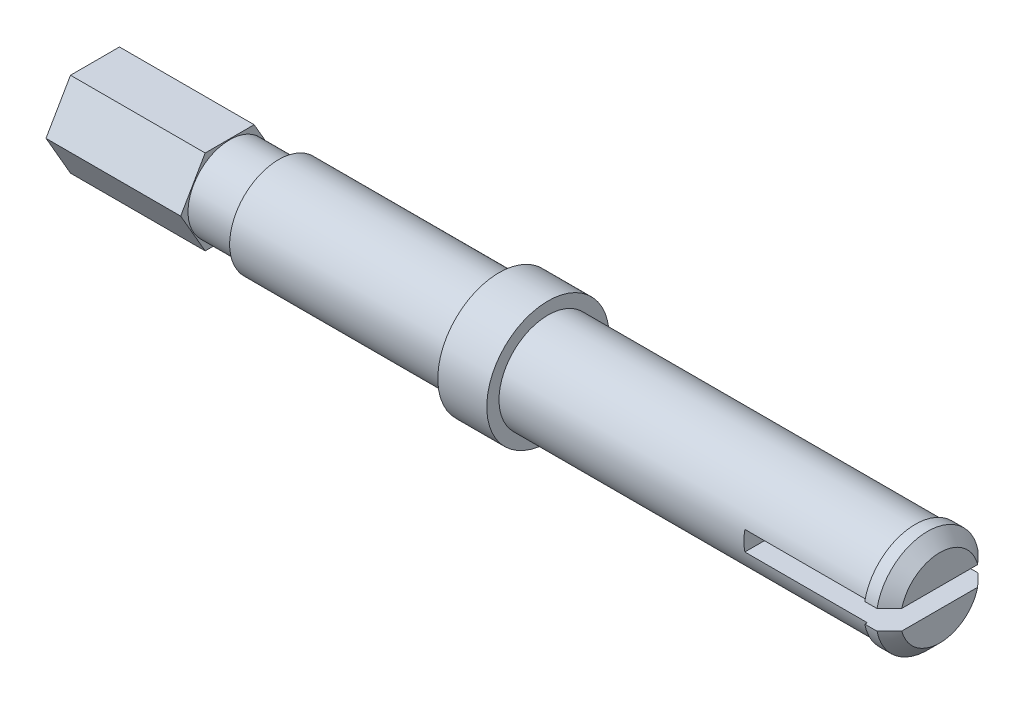
ISO-10303-21;
HEADER;
FILE_DESCRIPTION(('STEP AP214'),'2;1');
FILE_NAME('part.step','',(''),(''),'','','');
FILE_SCHEMA(('AUTOMOTIVE_DESIGN { 1 0 10303 214 1 1 1 1 }'));
ENDSEC;
DATA;
#1=APPLICATION_CONTEXT('core data for automotive mechanical design processes');
#2=APPLICATION_PROTOCOL_DEFINITION('international standard','automotive_design',2000,#1);
#3=PRODUCT_CONTEXT('',#1,'mechanical');
#4=PRODUCT('Part','Part','',(#3));
#5=PRODUCT_RELATED_PRODUCT_CATEGORY('part','',(#4));
#6=PRODUCT_DEFINITION_FORMATION('','',#4);
#7=PRODUCT_DEFINITION_CONTEXT('part definition',#1,'design');
#8=PRODUCT_DEFINITION('design','',#6,#7);
#9=PRODUCT_DEFINITION_SHAPE('','',#8);
#10=(LENGTH_UNIT() NAMED_UNIT(*) SI_UNIT(.MILLI.,.METRE.));
#11=(NAMED_UNIT(*) PLANE_ANGLE_UNIT() SI_UNIT($,.RADIAN.));
#12=(NAMED_UNIT(*) SI_UNIT($,.STERADIAN.) SOLID_ANGLE_UNIT());
#13=UNCERTAINTY_MEASURE_WITH_UNIT(LENGTH_MEASURE(1.E-05),#10,'distance_accuracy_value','');
#14=(GEOMETRIC_REPRESENTATION_CONTEXT(3) GLOBAL_UNCERTAINTY_ASSIGNED_CONTEXT((#13)) GLOBAL_UNIT_ASSIGNED_CONTEXT((#10,
#11,#12)) REPRESENTATION_CONTEXT('',''));
#15=CARTESIAN_POINT('',(0.,0.,0.));
#16=DIRECTION('',(0.,0.,1.));
#17=DIRECTION('',(1.,0.,0.));
#18=AXIS2_PLACEMENT_3D('',#15,#16,#17);
#19=CARTESIAN_POINT('',(33.5,0.,0.));
#20=DIRECTION('',(1.,0.,0.));
#21=DIRECTION('',(0.,0.,-1.));
#22=AXIS2_PLACEMENT_3D('',#19,#20,#21);
#23=PLANE('',#22);
#24=CARTESIAN_POINT('',(33.5,0.,0.));
#25=DIRECTION('',(1.,0.,0.));
#26=DIRECTION('',(0.,0.,-1.));
#27=AXIS2_PLACEMENT_3D('',#24,#25,#26);
#28=CIRCLE('',#27,2.1);
#29=CARTESIAN_POINT('',(33.5,0.4,-2.06155281280883));
#30=VERTEX_POINT('',#29);
#31=CARTESIAN_POINT('',(33.5,0.4,2.06155281280883));
#32=VERTEX_POINT('',#31);
#33=EDGE_CURVE('E265',#30,#32,#28,.T.);
#34=ORIENTED_EDGE('',*,*,#33,.F.);
#35=DIRECTION('',(0.,0.,1.));
#36=VECTOR('',#35,1.);
#37=CARTESIAN_POINT('',(33.5,0.4,0.));
#38=LINE('',#37,#36);
#39=CARTESIAN_POINT('',(33.5,0.4,-1.95959179422654));
#40=VERTEX_POINT('',#39);
#41=EDGE_CURVE('E267',#30,#40,#38,.T.);
#42=ORIENTED_EDGE('',*,*,#41,.T.);
#43=CARTESIAN_POINT('',(33.5,0.,0.));
#44=DIRECTION('',(1.,0.,0.));
#45=DIRECTION('',(0.,0.,-1.));
#46=AXIS2_PLACEMENT_3D('',#43,#44,#45);
#47=CIRCLE('',#46,2.);
#48=CARTESIAN_POINT('',(33.5,0.4,1.95959179422654));
#49=VERTEX_POINT('',#48);
#50=EDGE_CURVE('E155',#40,#49,#47,.T.);
#51=ORIENTED_EDGE('',*,*,#50,.T.);
#52=EDGE_CURVE('E271',#49,#32,#38,.T.);
#53=ORIENTED_EDGE('',*,*,#52,.T.);
#54=EDGE_LOOP('',(#34,#42,#51,#53));
#55=FACE_BOUND('',#54,.T.);
#56=ADVANCED_FACE('F34',(#55),#23,.F.);
#57=CARTESIAN_POINT('',(33.5,0.,0.));
#58=DIRECTION('',(1.,0.,0.));
#59=DIRECTION('',(0.,0.,-1.));
#60=AXIS2_PLACEMENT_3D('',#57,#58,#59);
#61=CYLINDRICAL_SURFACE('',#60,2.1);
#62=DIRECTION('',(1.,0.,0.));
#63=VECTOR('',#62,1.);
#64=CARTESIAN_POINT('',(33.5,0.4,2.06155281280883));
#65=LINE('',#64,#63);
#66=CARTESIAN_POINT('',(34.,0.4,2.06155281280883));
#67=VERTEX_POINT('',#66);
#68=EDGE_CURVE('E329',#67,#32,#65,.F.);
#69=ORIENTED_EDGE('',*,*,#68,.F.);
#70=CARTESIAN_POINT('',(34.,0.,0.));
#71=DIRECTION('',(1.,0.,0.));
#72=DIRECTION('',(0.,0.,-1.));
#73=AXIS2_PLACEMENT_3D('',#70,#71,#72);
#74=CIRCLE('',#73,2.1);
#75=CARTESIAN_POINT('',(34.,0.4,-2.06155281280883));
#76=VERTEX_POINT('',#75);
#77=EDGE_CURVE('E162',#67,#76,#74,.F.);
#78=ORIENTED_EDGE('',*,*,#77,.T.);
#79=DIRECTION('',(1.,0.,0.));
#80=VECTOR('',#79,1.);
#81=CARTESIAN_POINT('',(33.5,0.4,-2.06155281280883));
#82=LINE('',#81,#80);
#83=EDGE_CURVE('E322',#30,#76,#82,.T.);
#84=ORIENTED_EDGE('',*,*,#83,.F.);
#85=ORIENTED_EDGE('',*,*,#33,.T.);
#86=EDGE_LOOP('',(#69,#78,#84,#85));
#87=FACE_BOUND('',#86,.T.);
#88=ADVANCED_FACE('F197',(#87),#61,.T.);
#89=CARTESIAN_POINT('',(34.5,0.,0.));
#90=DIRECTION('',(1.,0.,0.));
#91=DIRECTION('',(0.,0.,-1.));
#92=AXIS2_PLACEMENT_3D('',#89,#90,#91);
#93=PLANE('',#92);
#94=DIRECTION('',(0.,0.,1.));
#95=VECTOR('',#94,1.);
#96=CARTESIAN_POINT('',(34.5,0.4,-2.5));
#97=LINE('',#96,#95);
#98=CARTESIAN_POINT('',(34.5,0.4,-1.54919333848296));
#99=VERTEX_POINT('',#98);
#100=CARTESIAN_POINT('',(34.5,0.4,1.54919333848296));
#101=VERTEX_POINT('',#100);
#102=EDGE_CURVE('E351',#99,#101,#97,.T.);
#103=ORIENTED_EDGE('',*,*,#102,.F.);
#104=CARTESIAN_POINT('',(34.5,0.,0.));
#105=DIRECTION('',(1.,0.,0.));
#106=DIRECTION('',(0.,0.,-1.));
#107=AXIS2_PLACEMENT_3D('',#104,#105,#106);
#108=CIRCLE('',#107,1.6);
#109=EDGE_CURVE('E159',#99,#101,#108,.T.);
#110=ORIENTED_EDGE('',*,*,#109,.T.);
#111=EDGE_LOOP('',(#103,#110));
#112=FACE_BOUND('',#111,.T.);
#113=ADVANCED_FACE('F201',(#112),#93,.T.);
#114=CARTESIAN_POINT('',(34.5,0.,0.));
#115=DIRECTION('',(-1.,0.,0.));
#116=DIRECTION('',(0.,0.,1.));
#117=AXIS2_PLACEMENT_3D('',#114,#115,#116);
#118=CONICAL_SURFACE('',#117,1.6,0.785398163397451);
#119=CARTESIAN_POINT('',(31.4620056820932,0.400000000000001,-4.62071328832853));
#120=CARTESIAN_POINT('',(31.6267282288878,0.400000000000001,-4.45536888012812));
#121=CARTESIAN_POINT('',(31.7914232324066,0.400000000000001,-4.28999698174511));
#122=CARTESIAN_POINT('',(32.120729349125,0.400000000000001,-3.9591493277016));
#123=CARTESIAN_POINT('',(32.2853404565067,0.400000000000001,-3.79367356625066));
#124=CARTESIAN_POINT('',(32.6146735626456,0.400000000000001,-3.46234430265822));
#125=CARTESIAN_POINT('',(32.7793953639427,0.400000000000001,-3.29649060422175));
#126=CARTESIAN_POINT('',(33.1086229545556,0.4,-2.96458859573897));
#127=CARTESIAN_POINT('',(33.2731287562648,0.4,-2.79854029799451));
#128=CARTESIAN_POINT('',(33.5916971165518,0.4,-2.47631379402679));
#129=CARTESIAN_POINT('',(33.7457803104458,0.4,-2.32015599034724));
#130=CARTESIAN_POINT('',(34.053445304274,0.4,-2.00729305242233));
#131=CARTESIAN_POINT('',(34.2070270133369,0.4,-1.85058782859063));
#132=CARTESIAN_POINT('',(34.4365007226751,0.4,-1.61478989074282));
#133=CARTESIAN_POINT('',(34.5128084628646,0.4,-1.53610233507543));
#134=CARTESIAN_POINT('',(34.6649874756702,0.4,-1.37829595442104));
#135=CARTESIAN_POINT('',(34.7408587186471,0.4,-1.29917710084209));
#136=CARTESIAN_POINT('',(34.8918589543585,0.4,-1.14027745631293));
#137=CARTESIAN_POINT('',(34.9669881734101,0.4,-1.06049688176115));
#138=CARTESIAN_POINT('',(35.0786527718135,0.4,-0.939879988891926));
#139=CARTESIAN_POINT('',(35.1157007731961,0.4,-0.899518913761242));
#140=CARTESIAN_POINT('',(35.1892939808212,0.4,-0.818341640017616));
#141=CARTESIAN_POINT('',(35.2258392068452,0.4,-0.777525459425747));
#142=CARTESIAN_POINT('',(35.2822181422698,0.4,-0.713362663205651));
#143=CARTESIAN_POINT('',(35.3023157518278,0.4,-0.690248181956688));
#144=CARTESIAN_POINT('',(35.3421973890748,0.4,-0.643745585800347));
#145=CARTESIAN_POINT('',(35.3619813853881,0.4,-0.620357443916147));
#146=CARTESIAN_POINT('',(35.4013388970203,0.4,-0.572977645618859));
#147=CARTESIAN_POINT('',(35.4209078738351,0.4,-0.548982205879127));
#148=CARTESIAN_POINT('',(35.4594477676603,0.4,-0.500523026710144));
#149=CARTESIAN_POINT('',(35.4784188324995,0.4,-0.476059405477448));
#150=CARTESIAN_POINT('',(35.5157357715621,0.4,-0.426195091492249));
#151=CARTESIAN_POINT('',(35.5340714113886,0.4,-0.400786676553507));
#152=CARTESIAN_POINT('',(35.5694662153485,0.4,-0.349033128819541));
#153=CARTESIAN_POINT('',(35.5865236475902,0.4,-0.32268679399008));
#154=CARTESIAN_POINT('',(35.6184178541365,0.4,-0.269040710017076));
#155=CARTESIAN_POINT('',(35.6332766197385,0.4,-0.241754328952145));
#156=CARTESIAN_POINT('',(35.6597018760107,0.4,-0.185665867034453));
#157=CARTESIAN_POINT('',(35.6712787010701,0.4,-0.156868890074849));
#158=CARTESIAN_POINT('',(35.6884585286207,0.4,-0.100130615637488));
#159=CARTESIAN_POINT('',(35.6944880875649,0.4,-0.0723271031333663));
#160=CARTESIAN_POINT('',(35.700633227419,0.4,-0.0161590419789652));
#161=CARTESIAN_POINT('',(35.7007780646195,0.4,0.012202029725148));
#162=CARTESIAN_POINT('',(35.6951959633118,0.4,0.0681578137637577));
#163=CARTESIAN_POINT('',(35.6894974798404,0.4,0.0957555741716353));
#164=CARTESIAN_POINT('',(35.6776475923944,0.4,0.136204803292051));
#165=CARTESIAN_POINT('',(35.6731234162029,0.4,0.149579574295066));
#166=CARTESIAN_POINT('',(35.6631675217043,0.4,0.175986616646824));
#167=CARTESIAN_POINT('',(35.6577359478612,0.4,0.189018942133694));
#168=CARTESIAN_POINT('',(35.6415866321195,0.4,0.224869237737755));
#169=CARTESIAN_POINT('',(35.6300704184402,0.4,0.247324603841456));
#170=CARTESIAN_POINT('',(35.6054671047588,0.4,0.291366277105348));
#171=CARTESIAN_POINT('',(35.5923782513888,0.4,0.312951577739852));
#172=CARTESIAN_POINT('',(35.551444304707,0.4,0.376827151276196));
#173=CARTESIAN_POINT('',(35.5220080591233,0.4,0.418087328138647));
#174=CARTESIAN_POINT('',(35.4607450791305,0.4,0.499349139649737));
#175=CARTESIAN_POINT('',(35.4288982477432,0.4,0.53933504534657));
#176=CARTESIAN_POINT('',(35.3640296610522,0.4,0.61818466431528));
#177=CARTESIAN_POINT('',(35.3310107994486,0.4,0.657050763349219));
#178=CARTESIAN_POINT('',(35.2649264334703,0.4,0.733279283772284));
#179=CARTESIAN_POINT('',(35.2318773305982,0.4,0.770656052569773));
#180=CARTESIAN_POINT('',(35.1652824925224,0.4,0.844965407885262));
#181=CARTESIAN_POINT('',(35.1317367446572,0.4,0.88189798303517));
#182=CARTESIAN_POINT('',(35.0305795361561,0.4,0.992236910774282));
#183=CARTESIAN_POINT('',(34.962457375675,0.4,1.06517397595159));
#184=CARTESIAN_POINT('',(34.8254013964689,0.4,1.2104413851798));
#185=CARTESIAN_POINT('',(34.7564667082264,0.4,1.2827709038118));
#186=CARTESIAN_POINT('',(34.6181488837314,0.4,1.4269886895793));
#187=CARTESIAN_POINT('',(34.5487657830838,0.4,1.49887699088568));
#188=CARTESIAN_POINT('',(34.3414602074161,0.4,1.7128086778753));
#189=CARTESIAN_POINT('',(34.2031174680887,0.4,1.85444422236948));
#190=CARTESIAN_POINT('',(33.9259449450494,0.4,2.13711347646962));
#191=CARTESIAN_POINT('',(33.7871154040441,0.4,2.27814742473358));
#192=CARTESIAN_POINT('',(33.4674666256911,0.399999999999999,2.60214061024328));
#193=CARTESIAN_POINT('',(33.2865379241783,0.399999999999999,2.78499183509939));
#194=CARTESIAN_POINT('',(32.924361923992,0.399999999999999,3.15043743558007));
#195=CARTESIAN_POINT('',(32.7431145780677,0.399999999999999,3.3330317643258));
#196=CARTESIAN_POINT('',(32.3786093960869,0.399999999999999,3.69989022029294));
#197=CARTESIAN_POINT('',(32.1953497629511,0.399999999999999,3.88415256178822));
#198=CARTESIAN_POINT('',(31.8287392316848,0.399999999999999,4.25252494064875));
#199=CARTESIAN_POINT('',(31.6453883540141,0.399999999999999,4.43663499837383));
#200=CARTESIAN_POINT('',(31.4620056820932,0.399999999999999,4.62071328832853));
#201=B_SPLINE_CURVE_WITH_KNOTS('',3,(#119,#120,#121,#122,#123,#124,#125,#126,#127,#128,#129,
#130,#131,#132,#133,#134,#135,#136,#137,#138,#139,#140,#141,#142,#143,#144,#145,#146,#147,#148,
#149,#150,#151,#152,#153,#154,#155,#156,#157,#158,#159,#160,#161,#162,#163,#164,#165,#166,#167,
#168,#169,#170,#171,#172,#173,#174,#175,#176,#177,#178,#179,#180,#181,#182,#183,#184,#185,#186,
#187,#188,#189,#190,#191,#192,#193,#194,#195,#196,#197,#198,#199,#200),.UNSPECIFIED.,.F.,.F.,(4,
2,2,2,2,2,2,2,2,2,2,2,2,2,2,2,2,2,2,2,2,2,2,2,2,2,2,2,2,2,2,2,2,2,2,2,2,2,2,2,4),(0.,
0.700179042912816,1.40040138764164,2.10166194800309,2.80288034094117,3.4610152346944,
4.11926341464865,4.44809558105204,4.77694981839161,5.10570044927818,5.27005783292464,
5.43440873136774,5.52629648875828,5.61819338184684,5.71107665478386,5.80393678002205,
5.89791125050213,5.99201083077404,6.08509424883953,6.17788121879951,6.2627250475303,
6.34714701756725,6.43115982390147,6.47349318277285,6.51581980828583,6.59142624128437,
6.66711776558301,6.81900222224851,6.9723332284401,7.12530891659257,7.27498149956892,
7.42465790494663,7.72405269399398,8.0238038144764,8.32353141959432,8.91749242445227,
9.51119050285921,10.2828942616009,11.0547241840561,11.834358848275,12.6138627635438),.UNSPECIFIED.);
#202=EDGE_CURVE('E407',#76,#99,#201,.T.);
#203=ORIENTED_EDGE('',*,*,#202,.F.);
#204=ORIENTED_EDGE('',*,*,#77,.F.);
#205=EDGE_CURVE('E172',#101,#67,#201,.T.);
#206=ORIENTED_EDGE('',*,*,#205,.F.);
#207=ORIENTED_EDGE('',*,*,#109,.F.);
#208=EDGE_LOOP('',(#203,#204,#206,#207));
#209=FACE_BOUND('',#208,.T.);
#210=ADVANCED_FACE('F206',(#209),#118,.T.);
#211=CARTESIAN_POINT('',(34.5,0.,0.));
#212=DIRECTION('',(-1.,0.,0.));
#213=DIRECTION('',(0.,0.,1.));
#214=AXIS2_PLACEMENT_3D('',#211,#212,#213);
#215=CYLINDRICAL_SURFACE('',#214,2.);
#216=CARTESIAN_POINT('',(28.5,0.,0.));
#217=DIRECTION('',(1.,0.,0.));
#218=DIRECTION('',(0.,0.,-1.));
#219=AXIS2_PLACEMENT_3D('',#216,#217,#218);
#220=CIRCLE('',#219,2.);
#221=CARTESIAN_POINT('',(28.5,0.4,1.95959179422654));
#222=VERTEX_POINT('',#221);
#223=CARTESIAN_POINT('',(28.5,-0.400000000000001,1.95959179422654));
#224=VERTEX_POINT('',#223);
#225=EDGE_CURVE('E11',#222,#224,#220,.T.);
#226=ORIENTED_EDGE('',*,*,#225,.F.);
#227=DIRECTION('',(-1.,0.,0.));
#228=VECTOR('',#227,1.);
#229=CARTESIAN_POINT('',(34.5,0.4,1.95959179422654));
#230=LINE('',#229,#228);
#231=EDGE_CURVE('E325',#222,#49,#230,.F.);
#232=ORIENTED_EDGE('',*,*,#231,.T.);
#233=ORIENTED_EDGE('',*,*,#50,.F.);
#234=DIRECTION('',(-1.,0.,0.));
#235=VECTOR('',#234,1.);
#236=CARTESIAN_POINT('',(34.5,0.4,-1.95959179422654));
#237=LINE('',#236,#235);
#238=CARTESIAN_POINT('',(28.5,0.4,-1.95959179422654));
#239=VERTEX_POINT('',#238);
#240=EDGE_CURVE('E282',#40,#239,#237,.T.);
#241=ORIENTED_EDGE('',*,*,#240,.T.);
#242=CARTESIAN_POINT('',(28.5,-0.4,-1.95959179422654));
#243=VERTEX_POINT('',#242);
#244=EDGE_CURVE('E39',#243,#239,#220,.T.);
#245=ORIENTED_EDGE('',*,*,#244,.F.);
#246=DIRECTION('',(-1.,0.,0.));
#247=VECTOR('',#246,1.);
#248=CARTESIAN_POINT('',(34.5,-0.4,-1.95959179422654));
#249=LINE('',#248,#247);
#250=CARTESIAN_POINT('',(33.5,-0.4,-1.95959179422654));
#251=VERTEX_POINT('',#250);
#252=EDGE_CURVE('E339',#243,#251,#249,.F.);
#253=ORIENTED_EDGE('',*,*,#252,.T.);
#254=CARTESIAN_POINT('',(33.5,-0.400000000000001,1.95959179422654));
#255=VERTEX_POINT('',#254);
#256=EDGE_CURVE('E154',#255,#251,#47,.T.);
#257=ORIENTED_EDGE('',*,*,#256,.F.);
#258=DIRECTION('',(-1.,0.,0.));
#259=VECTOR('',#258,1.);
#260=CARTESIAN_POINT('',(34.5,-0.400000000000001,1.95959179422654));
#261=LINE('',#260,#259);
#262=EDGE_CURVE('E332',#255,#224,#261,.T.);
#263=ORIENTED_EDGE('',*,*,#262,.T.);
#264=EDGE_LOOP('',(#226,#232,#233,#241,#245,#253,#257,#263));
#265=FACE_BOUND('',#264,.T.);
#266=CARTESIAN_POINT('',(18.5,0.,0.));
#267=DIRECTION('',(1.,0.,0.));
#268=DIRECTION('',(0.,0.,-1.));
#269=AXIS2_PLACEMENT_3D('',#266,#267,#268);
#270=CIRCLE('',#269,2.);
#271=CARTESIAN_POINT('',(18.5,0.,-2.));
#272=VERTEX_POINT('',#271);
#273=EDGE_CURVE('E275',#272,#272,#270,.T.);
#274=ORIENTED_EDGE('',*,*,#273,.T.);
#275=EDGE_LOOP('',(#274));
#276=FACE_BOUND('',#275,.T.);
#277=ADVANCED_FACE('F202',(#265,#276),#215,.T.);
#278=CARTESIAN_POINT('',(18.5,0.,0.));
#279=DIRECTION('',(1.,0.,0.));
#280=DIRECTION('',(0.,0.,-1.));
#281=AXIS2_PLACEMENT_3D('',#278,#279,#280);
#282=PLANE('',#281);
#283=CARTESIAN_POINT('',(18.5,0.,0.));
#284=DIRECTION('',(1.,0.,0.));
#285=DIRECTION('',(0.,0.,-1.));
#286=AXIS2_PLACEMENT_3D('',#283,#284,#285);
#287=CIRCLE('',#286,2.5);
#288=CARTESIAN_POINT('',(18.5,0.,-2.5));
#289=VERTEX_POINT('',#288);
#290=EDGE_CURVE('E286',#289,#289,#287,.T.);
#291=ORIENTED_EDGE('',*,*,#290,.T.);
#292=EDGE_LOOP('',(#291));
#293=FACE_BOUND('',#292,.T.);
#294=ORIENTED_EDGE('',*,*,#273,.F.);
#295=EDGE_LOOP('',(#294));
#296=FACE_BOUND('',#295,.T.);
#297=ADVANCED_FACE('F205',(#293,#296),#282,.T.);
#298=CARTESIAN_POINT('',(5.5,0.,0.));
#299=DIRECTION('',(1.,0.,0.));
#300=DIRECTION('',(0.,0.,-1.));
#301=AXIS2_PLACEMENT_3D('',#298,#299,#300);
#302=PLANE('',#301);
#303=DIRECTION('',(0.,-0.866025403784438,0.500000000000001));
#304=VECTOR('',#303,1.);
#305=CARTESIAN_POINT('',(5.5,1.73205080756887,1.));
#306=LINE('',#305,#304);
#307=CARTESIAN_POINT('',(5.5,1.73205080756887,1.));
#308=VERTEX_POINT('',#307);
#309=CARTESIAN_POINT('',(5.5,0.,2.));
#310=VERTEX_POINT('',#309);
#311=EDGE_CURVE('E145',#308,#310,#306,.T.);
#312=ORIENTED_EDGE('',*,*,#311,.T.);
#313=DIRECTION('',(0.,-0.866025403784439,-0.499999999999999));
#314=VECTOR('',#313,1.);
#315=CARTESIAN_POINT('',(5.5,0.,2.));
#316=LINE('',#315,#314);
#317=CARTESIAN_POINT('',(5.5,-1.73205080756888,1.));
#318=VERTEX_POINT('',#317);
#319=EDGE_CURVE('E95',#310,#318,#316,.T.);
#320=ORIENTED_EDGE('',*,*,#319,.T.);
#321=DIRECTION('',(0.,0.,-1.));
#322=VECTOR('',#321,1.);
#323=CARTESIAN_POINT('',(5.5,-1.73205080756888,1.));
#324=LINE('',#323,#322);
#325=CARTESIAN_POINT('',(5.5,-1.73205080756888,-1.));
#326=VERTEX_POINT('',#325);
#327=EDGE_CURVE('E112',#318,#326,#324,.T.);
#328=ORIENTED_EDGE('',*,*,#327,.T.);
#329=DIRECTION('',(0.,0.866025403784439,-0.499999999999999));
#330=VECTOR('',#329,1.);
#331=CARTESIAN_POINT('',(5.5,-1.73205080756888,-1.));
#332=LINE('',#331,#330);
#333=CARTESIAN_POINT('',(5.5,0.,-2.));
#334=VERTEX_POINT('',#333);
#335=EDGE_CURVE('E104',#326,#334,#332,.T.);
#336=ORIENTED_EDGE('',*,*,#335,.T.);
#337=DIRECTION('',(0.,0.866025403784439,0.499999999999999));
#338=VECTOR('',#337,1.);
#339=CARTESIAN_POINT('',(5.5,0.,-2.));
#340=LINE('',#339,#338);
#341=CARTESIAN_POINT('',(5.5,1.73205080756888,-1.));
#342=VERTEX_POINT('',#341);
#343=EDGE_CURVE('E109',#334,#342,#340,.T.);
#344=ORIENTED_EDGE('',*,*,#343,.T.);
#345=DIRECTION('',(0.,0.,1.));
#346=VECTOR('',#345,1.);
#347=CARTESIAN_POINT('',(5.5,1.73205080756888,-1.));
#348=LINE('',#347,#346);
#349=EDGE_CURVE('E59',#342,#308,#348,.T.);
#350=ORIENTED_EDGE('',*,*,#349,.T.);
#351=EDGE_LOOP('',(#312,#320,#328,#336,#344,#350));
#352=FACE_BOUND('',#351,.T.);
#353=CARTESIAN_POINT('',(5.5,0.,0.));
#354=DIRECTION('',(1.,0.,0.));
#355=DIRECTION('',(0.,0.,-1.));
#356=AXIS2_PLACEMENT_3D('',#353,#354,#355);
#357=CIRCLE('',#356,1.7);
#358=CARTESIAN_POINT('',(5.5,0.,-1.7));
#359=VERTEX_POINT('',#358);
#360=EDGE_CURVE('E295',#359,#359,#357,.T.);
#361=ORIENTED_EDGE('',*,*,#360,.F.);
#362=EDGE_LOOP('',(#361));
#363=FACE_BOUND('',#362,.T.);
#364=ADVANCED_FACE('F106',(#352,#363),#302,.T.);
#365=CARTESIAN_POINT('',(5.5,1.73205080756887,1.));
#366=DIRECTION('',(0.,-0.500000000000001,-0.866025403784438));
#367=DIRECTION('',(0.,0.866025403784438,-0.500000000000001));
#368=AXIS2_PLACEMENT_3D('',#365,#366,#367);
#369=PLANE('',#368);
#370=DIRECTION('',(0.,-0.866025403784438,0.500000000000001));
#371=VECTOR('',#370,1.);
#372=CARTESIAN_POINT('',(0.,1.73205080756887,1.));
#373=LINE('',#372,#371);
#374=CARTESIAN_POINT('',(0.,1.73205080756887,1.));
#375=VERTEX_POINT('',#374);
#376=CARTESIAN_POINT('',(0.,0.,2.));
#377=VERTEX_POINT('',#376);
#378=EDGE_CURVE('E133',#375,#377,#373,.T.);
#379=ORIENTED_EDGE('',*,*,#378,.T.);
#380=DIRECTION('',(-1.,0.,0.));
#381=VECTOR('',#380,1.);
#382=CARTESIAN_POINT('',(5.5,0.,2.));
#383=LINE('',#382,#381);
#384=EDGE_CURVE('E152',#310,#377,#383,.T.);
#385=ORIENTED_EDGE('',*,*,#384,.F.);
#386=ORIENTED_EDGE('',*,*,#311,.F.);
#387=DIRECTION('',(-1.,0.,0.));
#388=VECTOR('',#387,1.);
#389=CARTESIAN_POINT('',(5.5,1.73205080756887,1.));
#390=LINE('',#389,#388);
#391=EDGE_CURVE('E129',#308,#375,#390,.T.);
#392=ORIENTED_EDGE('',*,*,#391,.T.);
#393=EDGE_LOOP('',(#379,#385,#386,#392));
#394=FACE_BOUND('',#393,.T.);
#395=ADVANCED_FACE('F233',(#394),#369,.F.);
#396=CARTESIAN_POINT('',(5.5,0.,2.));
#397=DIRECTION('',(0.,0.499999999999999,-0.866025403784439));
#398=DIRECTION('',(0.,0.866025403784439,0.499999999999999));
#399=AXIS2_PLACEMENT_3D('',#396,#397,#398);
#400=PLANE('',#399);
#401=DIRECTION('',(0.,-0.866025403784439,-0.499999999999999));
#402=VECTOR('',#401,1.);
#403=CARTESIAN_POINT('',(0.,0.,2.));
#404=LINE('',#403,#402);
#405=CARTESIAN_POINT('',(0.,-1.73205080756888,1.));
#406=VERTEX_POINT('',#405);
#407=EDGE_CURVE('E136',#377,#406,#404,.T.);
#408=ORIENTED_EDGE('',*,*,#407,.T.);
#409=DIRECTION('',(-1.,0.,0.));
#410=VECTOR('',#409,1.);
#411=CARTESIAN_POINT('',(5.5,-1.73205080756888,1.));
#412=LINE('',#411,#410);
#413=EDGE_CURVE('E149',#318,#406,#412,.T.);
#414=ORIENTED_EDGE('',*,*,#413,.F.);
#415=ORIENTED_EDGE('',*,*,#319,.F.);
#416=ORIENTED_EDGE('',*,*,#384,.T.);
#417=EDGE_LOOP('',(#408,#414,#415,#416));
#418=FACE_BOUND('',#417,.T.);
#419=ADVANCED_FACE('F247',(#418),#400,.F.);
#420=CARTESIAN_POINT('',(5.5,-1.73205080756888,1.));
#421=DIRECTION('',(0.,1.,0.));
#422=DIRECTION('',(0.,0.,1.));
#423=AXIS2_PLACEMENT_3D('',#420,#421,#422);
#424=PLANE('',#423);
#425=DIRECTION('',(0.,0.,-1.));
#426=VECTOR('',#425,1.);
#427=CARTESIAN_POINT('',(0.,-1.73205080756888,1.));
#428=LINE('',#427,#426);
#429=CARTESIAN_POINT('',(0.,-1.73205080756888,-1.));
#430=VERTEX_POINT('',#429);
#431=EDGE_CURVE('E139',#406,#430,#428,.T.);
#432=ORIENTED_EDGE('',*,*,#431,.T.);
#433=DIRECTION('',(-1.,0.,0.));
#434=VECTOR('',#433,1.);
#435=CARTESIAN_POINT('',(5.5,-1.73205080756888,-1.));
#436=LINE('',#435,#434);
#437=EDGE_CURVE('E124',#326,#430,#436,.T.);
#438=ORIENTED_EDGE('',*,*,#437,.F.);
#439=ORIENTED_EDGE('',*,*,#327,.F.);
#440=ORIENTED_EDGE('',*,*,#413,.T.);
#441=EDGE_LOOP('',(#432,#438,#439,#440));
#442=FACE_BOUND('',#441,.T.);
#443=ADVANCED_FACE('F244',(#442),#424,.F.);
#444=CARTESIAN_POINT('',(5.5,-1.73205080756888,-1.));
#445=DIRECTION('',(0.,0.499999999999999,0.866025403784439));
#446=DIRECTION('',(0.,-0.866025403784439,0.499999999999999));
#447=AXIS2_PLACEMENT_3D('',#444,#445,#446);
#448=PLANE('',#447);
#449=DIRECTION('',(0.,0.866025403784439,-0.499999999999999));
#450=VECTOR('',#449,1.);
#451=CARTESIAN_POINT('',(0.,-1.73205080756888,-1.));
#452=LINE('',#451,#450);
#453=CARTESIAN_POINT('',(0.,0.,-2.));
#454=VERTEX_POINT('',#453);
#455=EDGE_CURVE('E121',#430,#454,#452,.T.);
#456=ORIENTED_EDGE('',*,*,#455,.T.);
#457=DIRECTION('',(-1.,0.,0.));
#458=VECTOR('',#457,1.);
#459=CARTESIAN_POINT('',(5.5,0.,-2.));
#460=LINE('',#459,#458);
#461=EDGE_CURVE('E118',#334,#454,#460,.T.);
#462=ORIENTED_EDGE('',*,*,#461,.F.);
#463=ORIENTED_EDGE('',*,*,#335,.F.);
#464=ORIENTED_EDGE('',*,*,#437,.T.);
#465=EDGE_LOOP('',(#456,#462,#463,#464));
#466=FACE_BOUND('',#465,.T.);
#467=ADVANCED_FACE('F119',(#466),#448,.F.);
#468=CARTESIAN_POINT('',(5.5,0.,-2.));
#469=DIRECTION('',(0.,-0.499999999999999,0.866025403784439));
#470=DIRECTION('',(0.,-0.866025403784439,-0.499999999999999));
#471=AXIS2_PLACEMENT_3D('',#468,#469,#470);
#472=PLANE('',#471);
#473=DIRECTION('',(0.,0.866025403784439,0.499999999999999));
#474=VECTOR('',#473,1.);
#475=CARTESIAN_POINT('',(0.,0.,-2.));
#476=LINE('',#475,#474);
#477=CARTESIAN_POINT('',(0.,1.73205080756888,-1.));
#478=VERTEX_POINT('',#477);
#479=EDGE_CURVE('E142',#454,#478,#476,.T.);
#480=ORIENTED_EDGE('',*,*,#479,.T.);
#481=DIRECTION('',(-1.,0.,0.));
#482=VECTOR('',#481,1.);
#483=CARTESIAN_POINT('',(5.5,1.73205080756888,-1.));
#484=LINE('',#483,#482);
#485=EDGE_CURVE('E125',#342,#478,#484,.T.);
#486=ORIENTED_EDGE('',*,*,#485,.F.);
#487=ORIENTED_EDGE('',*,*,#343,.F.);
#488=ORIENTED_EDGE('',*,*,#461,.T.);
#489=EDGE_LOOP('',(#480,#486,#487,#488));
#490=FACE_BOUND('',#489,.T.);
#491=ADVANCED_FACE('F127',(#490),#472,.F.);
#492=CARTESIAN_POINT('',(5.5,1.73205080756888,-1.));
#493=DIRECTION('',(0.,-1.,0.));
#494=DIRECTION('',(0.,0.,-1.));
#495=AXIS2_PLACEMENT_3D('',#492,#493,#494);
#496=PLANE('',#495);
#497=DIRECTION('',(0.,0.,1.));
#498=VECTOR('',#497,1.);
#499=CARTESIAN_POINT('',(0.,1.73205080756888,-1.));
#500=LINE('',#499,#498);
#501=EDGE_CURVE('E86',#478,#375,#500,.T.);
#502=ORIENTED_EDGE('',*,*,#501,.T.);
#503=ORIENTED_EDGE('',*,*,#391,.F.);
#504=ORIENTED_EDGE('',*,*,#349,.F.);
#505=ORIENTED_EDGE('',*,*,#485,.T.);
#506=EDGE_LOOP('',(#502,#503,#504,#505));
#507=FACE_BOUND('',#506,.T.);
#508=ADVANCED_FACE('F236',(#507),#496,.F.);
#509=CARTESIAN_POINT('',(0.,0.,0.));
#510=DIRECTION('',(1.,0.,0.));
#511=DIRECTION('',(0.,0.,-1.));
#512=AXIS2_PLACEMENT_3D('',#509,#510,#511);
#513=PLANE('',#512);
#514=ORIENTED_EDGE('',*,*,#378,.F.);
#515=ORIENTED_EDGE('',*,*,#501,.F.);
#516=ORIENTED_EDGE('',*,*,#479,.F.);
#517=ORIENTED_EDGE('',*,*,#455,.F.);
#518=ORIENTED_EDGE('',*,*,#431,.F.);
#519=ORIENTED_EDGE('',*,*,#407,.F.);
#520=EDGE_LOOP('',(#514,#515,#516,#517,#518,#519));
#521=FACE_BOUND('',#520,.T.);
#522=ADVANCED_FACE('F229',(#521),#513,.F.);
#523=CARTESIAN_POINT('',(7.5,0.,0.));
#524=DIRECTION('',(-1.,0.,0.));
#525=DIRECTION('',(0.,0.,1.));
#526=AXIS2_PLACEMENT_3D('',#523,#524,#525);
#527=CYLINDRICAL_SURFACE('',#526,1.7);
#528=CARTESIAN_POINT('',(7.5,0.,0.));
#529=DIRECTION('',(1.,0.,0.));
#530=DIRECTION('',(0.,0.,-1.));
#531=AXIS2_PLACEMENT_3D('',#528,#529,#530);
#532=CIRCLE('',#531,1.7);
#533=CARTESIAN_POINT('',(7.5,0.,-1.7));
#534=VERTEX_POINT('',#533);
#535=EDGE_CURVE('E137',#534,#534,#532,.T.);
#536=ORIENTED_EDGE('',*,*,#535,.F.);
#537=EDGE_LOOP('',(#536));
#538=FACE_BOUND('',#537,.T.);
#539=ORIENTED_EDGE('',*,*,#360,.T.);
#540=EDGE_LOOP('',(#539));
#541=FACE_BOUND('',#540,.T.);
#542=ADVANCED_FACE('F222',(#538,#541),#527,.T.);
#543=CARTESIAN_POINT('',(7.5,0.,0.));
#544=DIRECTION('',(1.,0.,0.));
#545=DIRECTION('',(0.,0.,-1.));
#546=AXIS2_PLACEMENT_3D('',#543,#544,#545);
#547=PLANE('',#546);
#548=CARTESIAN_POINT('',(7.5,0.,0.));
#549=DIRECTION('',(1.,0.,0.));
#550=DIRECTION('',(0.,0.,-1.));
#551=AXIS2_PLACEMENT_3D('',#548,#549,#550);
#552=CIRCLE('',#551,2.);
#553=CARTESIAN_POINT('',(7.5,0.,-2.));
#554=VERTEX_POINT('',#553);
#555=EDGE_CURVE('E289',#554,#554,#552,.T.);
#556=ORIENTED_EDGE('',*,*,#555,.F.);
#557=EDGE_LOOP('',(#556));
#558=FACE_BOUND('',#557,.T.);
#559=ORIENTED_EDGE('',*,*,#535,.T.);
#560=EDGE_LOOP('',(#559));
#561=FACE_BOUND('',#560,.T.);
#562=ADVANCED_FACE('F219',(#558,#561),#547,.F.);
#563=CARTESIAN_POINT('',(16.5,0.,0.));
#564=DIRECTION('',(-1.,0.,0.));
#565=DIRECTION('',(0.,0.,1.));
#566=AXIS2_PLACEMENT_3D('',#563,#564,#565);
#567=CYLINDRICAL_SURFACE('',#566,2.);
#568=CARTESIAN_POINT('',(16.5,0.,0.));
#569=DIRECTION('',(1.,0.,0.));
#570=DIRECTION('',(0.,0.,-1.));
#571=AXIS2_PLACEMENT_3D('',#568,#569,#570);
#572=CIRCLE('',#571,2.);
#573=CARTESIAN_POINT('',(16.5,0.,-2.));
#574=VERTEX_POINT('',#573);
#575=EDGE_CURVE('E292',#574,#574,#572,.T.);
#576=ORIENTED_EDGE('',*,*,#575,.F.);
#577=EDGE_LOOP('',(#576));
#578=FACE_BOUND('',#577,.T.);
#579=ORIENTED_EDGE('',*,*,#555,.T.);
#580=EDGE_LOOP('',(#579));
#581=FACE_BOUND('',#580,.T.);
#582=ADVANCED_FACE('F214',(#578,#581),#567,.T.);
#583=CARTESIAN_POINT('',(16.5,0.,0.));
#584=DIRECTION('',(1.,0.,0.));
#585=DIRECTION('',(0.,0.,-1.));
#586=AXIS2_PLACEMENT_3D('',#583,#584,#585);
#587=PLANE('',#586);
#588=CARTESIAN_POINT('',(16.5,0.,0.));
#589=DIRECTION('',(1.,0.,0.));
#590=DIRECTION('',(0.,0.,-1.));
#591=AXIS2_PLACEMENT_3D('',#588,#589,#590);
#592=CIRCLE('',#591,2.5);
#593=CARTESIAN_POINT('',(16.5,0.,-2.5));
#594=VERTEX_POINT('',#593);
#595=EDGE_CURVE('E279',#594,#594,#592,.T.);
#596=ORIENTED_EDGE('',*,*,#595,.F.);
#597=EDGE_LOOP('',(#596));
#598=FACE_BOUND('',#597,.T.);
#599=ORIENTED_EDGE('',*,*,#575,.T.);
#600=EDGE_LOOP('',(#599));
#601=FACE_BOUND('',#600,.T.);
#602=ADVANCED_FACE('F211',(#598,#601),#587,.F.);
#603=CARTESIAN_POINT('',(18.5,0.,0.));
#604=DIRECTION('',(-1.,0.,0.));
#605=DIRECTION('',(0.,0.,1.));
#606=AXIS2_PLACEMENT_3D('',#603,#604,#605);
#607=CYLINDRICAL_SURFACE('',#606,2.5);
#608=ORIENTED_EDGE('',*,*,#290,.F.);
#609=EDGE_LOOP('',(#608));
#610=FACE_BOUND('',#609,.T.);
#611=ORIENTED_EDGE('',*,*,#595,.T.);
#612=EDGE_LOOP('',(#611));
#613=FACE_BOUND('',#612,.T.);
#614=ADVANCED_FACE('F191',(#610,#613),#607,.T.);
#615=CARTESIAN_POINT('',(33.5,-0.400000000000001,2.06155281280883));
#616=VERTEX_POINT('',#615);
#617=CARTESIAN_POINT('',(33.5,-0.4,-2.06155281280883));
#618=VERTEX_POINT('',#617);
#619=EDGE_CURVE('E276',#616,#618,#28,.T.);
#620=ORIENTED_EDGE('',*,*,#619,.F.);
#621=DIRECTION('',(0.,0.,-1.));
#622=VECTOR('',#621,1.);
#623=CARTESIAN_POINT('',(33.5,-0.4,0.));
#624=LINE('',#623,#622);
#625=EDGE_CURVE('E335',#616,#255,#624,.T.);
#626=ORIENTED_EDGE('',*,*,#625,.T.);
#627=ORIENTED_EDGE('',*,*,#256,.T.);
#628=EDGE_CURVE('E342',#251,#618,#624,.T.);
#629=ORIENTED_EDGE('',*,*,#628,.T.);
#630=EDGE_LOOP('',(#620,#626,#627,#629));
#631=FACE_BOUND('',#630,.T.);
#632=ADVANCED_FACE('F187',(#631),#23,.F.);
#633=DIRECTION('',(1.,0.,0.));
#634=VECTOR('',#633,1.);
#635=CARTESIAN_POINT('',(33.5,-0.4,-2.06155281280883));
#636=LINE('',#635,#634);
#637=CARTESIAN_POINT('',(34.,-0.4,-2.06155281280883));
#638=VERTEX_POINT('',#637);
#639=EDGE_CURVE('E345',#638,#618,#636,.F.);
#640=ORIENTED_EDGE('',*,*,#639,.F.);
#641=CARTESIAN_POINT('',(34.,-0.400000000000001,2.06155281280883));
#642=VERTEX_POINT('',#641);
#643=EDGE_CURVE('E163',#638,#642,#74,.F.);
#644=ORIENTED_EDGE('',*,*,#643,.T.);
#645=DIRECTION('',(1.,0.,0.));
#646=VECTOR('',#645,1.);
#647=CARTESIAN_POINT('',(33.5,-0.400000000000001,2.06155281280883));
#648=LINE('',#647,#646);
#649=EDGE_CURVE('E336',#616,#642,#648,.T.);
#650=ORIENTED_EDGE('',*,*,#649,.F.);
#651=ORIENTED_EDGE('',*,*,#619,.T.);
#652=EDGE_LOOP('',(#640,#644,#650,#651));
#653=FACE_BOUND('',#652,.T.);
#654=ADVANCED_FACE('F190',(#653),#61,.T.);
#655=DIRECTION('',(0.,0.,-1.));
#656=VECTOR('',#655,1.);
#657=CARTESIAN_POINT('',(34.5,-0.4,-2.5));
#658=LINE('',#657,#656);
#659=CARTESIAN_POINT('',(34.5,-0.4,1.54919333848296));
#660=VERTEX_POINT('',#659);
#661=CARTESIAN_POINT('',(34.5,-0.4,-1.54919333848296));
#662=VERTEX_POINT('',#661);
#663=EDGE_CURVE('E50',#660,#662,#658,.T.);
#664=ORIENTED_EDGE('',*,*,#663,.F.);
#665=EDGE_CURVE('E158',#660,#662,#108,.T.);
#666=ORIENTED_EDGE('',*,*,#665,.T.);
#667=EDGE_LOOP('',(#664,#666));
#668=FACE_BOUND('',#667,.T.);
#669=ADVANCED_FACE('F195',(#668),#93,.T.);
#670=CARTESIAN_POINT('',(31.4620056820932,-0.400000000000001,4.62071328832853));
#671=CARTESIAN_POINT('',(31.6267282288878,-0.400000000000001,4.45536888012812));
#672=CARTESIAN_POINT('',(31.7914232324065,-0.400000000000001,4.28999698174511));
#673=CARTESIAN_POINT('',(32.120729349125,-0.400000000000001,3.95914932770161));
#674=CARTESIAN_POINT('',(32.2853404565067,-0.400000000000001,3.79367356625066));
#675=CARTESIAN_POINT('',(32.6146735626456,-0.400000000000001,3.46234430265823));
#676=CARTESIAN_POINT('',(32.7793953639426,-0.400000000000001,3.29649060422176));
#677=CARTESIAN_POINT('',(33.1086229545556,-0.400000000000001,2.96458859573898));
#678=CARTESIAN_POINT('',(33.2731287562648,-0.400000000000001,2.79854029799451));
#679=CARTESIAN_POINT('',(33.5916971165518,-0.400000000000001,2.4763137940268));
#680=CARTESIAN_POINT('',(33.7457803104457,-0.400000000000001,2.32015599034725));
#681=CARTESIAN_POINT('',(34.053445304274,-0.400000000000001,2.00729305242234));
#682=CARTESIAN_POINT('',(34.2070270133368,-0.4,1.85058782859064));
#683=CARTESIAN_POINT('',(34.4365007226751,-0.4,1.61478989074283));
#684=CARTESIAN_POINT('',(34.5128084628646,-0.4,1.53610233507544));
#685=CARTESIAN_POINT('',(34.6649874756702,-0.4,1.37829595442104));
#686=CARTESIAN_POINT('',(34.7408587186471,-0.4,1.2991771008421));
#687=CARTESIAN_POINT('',(34.8918589543585,-0.4,1.14027745631293));
#688=CARTESIAN_POINT('',(34.9669881734101,-0.4,1.06049688176115));
#689=CARTESIAN_POINT('',(35.0786527718135,-0.4,0.939879988891926));
#690=CARTESIAN_POINT('',(35.1157007731961,-0.4,0.899518913761242));
#691=CARTESIAN_POINT('',(35.1892939808212,-0.4,0.818341640017616));
#692=CARTESIAN_POINT('',(35.2258392068452,-0.4,0.777525459425747));
#693=CARTESIAN_POINT('',(35.2822181422698,-0.4,0.713362663205654));
#694=CARTESIAN_POINT('',(35.3023157518278,-0.4,0.690248181956694));
#695=CARTESIAN_POINT('',(35.3421973890748,-0.4,0.643745585800356));
#696=CARTESIAN_POINT('',(35.3619813853881,-0.4,0.620357443916155));
#697=CARTESIAN_POINT('',(35.4013388970203,-0.4,0.572977645618866));
#698=CARTESIAN_POINT('',(35.4209078738351,-0.4,0.548982205879132));
#699=CARTESIAN_POINT('',(35.4594477676603,-0.4,0.500523026710148));
#700=CARTESIAN_POINT('',(35.4784188324995,-0.4,0.47605940547745));
#701=CARTESIAN_POINT('',(35.5157357715621,-0.4,0.426195091492249));
#702=CARTESIAN_POINT('',(35.5340714113886,-0.4,0.400786676553507));
#703=CARTESIAN_POINT('',(35.5694662153485,-0.4,0.349033128819541));
#704=CARTESIAN_POINT('',(35.5865236475902,-0.4,0.32268679399008));
#705=CARTESIAN_POINT('',(35.6184178541365,-0.4,0.269040710017075));
#706=CARTESIAN_POINT('',(35.6332766197385,-0.4,0.241754328952145));
#707=CARTESIAN_POINT('',(35.6597018760107,-0.4,0.185665867034452));
#708=CARTESIAN_POINT('',(35.6712787010701,-0.4,0.156868890074848));
#709=CARTESIAN_POINT('',(35.6884585286207,-0.4,0.100130615637487));
#710=CARTESIAN_POINT('',(35.6944880875649,-0.4,0.0723271031333658));
#711=CARTESIAN_POINT('',(35.700633227419,-0.4,0.016159041978965));
#712=CARTESIAN_POINT('',(35.7007780646195,-0.4,-0.0122020297251481));
#713=CARTESIAN_POINT('',(35.6951959633118,-0.4,-0.0681578137637586));
#714=CARTESIAN_POINT('',(35.6894974798404,-0.4,-0.095755574171637));
#715=CARTESIAN_POINT('',(35.6776475923944,-0.4,-0.136204803292051));
#716=CARTESIAN_POINT('',(35.6731234162029,-0.4,-0.149579574295066));
#717=CARTESIAN_POINT('',(35.6631675217042,-0.4,-0.175986616646823));
#718=CARTESIAN_POINT('',(35.6577359478612,-0.4,-0.189018942133695));
#719=CARTESIAN_POINT('',(35.6415866321195,-0.4,-0.224869237737758));
#720=CARTESIAN_POINT('',(35.6300704184402,-0.4,-0.247324603841458));
#721=CARTESIAN_POINT('',(35.6054671047588,-0.4,-0.291366277105351));
#722=CARTESIAN_POINT('',(35.5923782513888,-0.4,-0.312951577739856));
#723=CARTESIAN_POINT('',(35.551444304707,-0.4,-0.376827151276201));
#724=CARTESIAN_POINT('',(35.5220080591233,-0.4,-0.41808732813865));
#725=CARTESIAN_POINT('',(35.4607450791305,-0.4,-0.499349139649742));
#726=CARTESIAN_POINT('',(35.4288982477432,-0.4,-0.539335045346578));
#727=CARTESIAN_POINT('',(35.3640296610522,-0.4,-0.618184664315288));
#728=CARTESIAN_POINT('',(35.3310107994486,-0.4,-0.657050763349224));
#729=CARTESIAN_POINT('',(35.2649264334703,-0.4,-0.733279283772287));
#730=CARTESIAN_POINT('',(35.2318773305982,-0.4,-0.770656052569778));
#731=CARTESIAN_POINT('',(35.1652824925224,-0.4,-0.844965407885269));
#732=CARTESIAN_POINT('',(35.1317367446572,-0.4,-0.881897983035176));
#733=CARTESIAN_POINT('',(35.0305795361561,-0.4,-0.992236910774289));
#734=CARTESIAN_POINT('',(34.962457375675,-0.4,-1.0651739759516));
#735=CARTESIAN_POINT('',(34.8254013964689,-0.4,-1.21044138517981));
#736=CARTESIAN_POINT('',(34.7564667082264,-0.4,-1.28277090381181));
#737=CARTESIAN_POINT('',(34.6181488837314,-0.4,-1.42698868957931));
#738=CARTESIAN_POINT('',(34.5487657830838,-0.4,-1.49887699088569));
#739=CARTESIAN_POINT('',(34.3414602074161,-0.4,-1.71280867787532));
#740=CARTESIAN_POINT('',(34.2031174680887,-0.4,-1.8544442223695));
#741=CARTESIAN_POINT('',(33.9259449450494,-0.4,-2.13711347646964));
#742=CARTESIAN_POINT('',(33.7871154040441,-0.4,-2.27814742473359));
#743=CARTESIAN_POINT('',(33.467466625691,-0.4,-2.60214061024329));
#744=CARTESIAN_POINT('',(33.2865379241783,-0.4,-2.7849918350994));
#745=CARTESIAN_POINT('',(32.924361923992,-0.4,-3.15043743558008));
#746=CARTESIAN_POINT('',(32.7431145780677,-0.399999999999999,-3.33303176432581));
#747=CARTESIAN_POINT('',(32.3786093960868,-0.399999999999999,-3.69989022029295));
#748=CARTESIAN_POINT('',(32.195349762951,-0.399999999999999,-3.88415256178823));
#749=CARTESIAN_POINT('',(31.8287392316848,-0.399999999999999,-4.25252494064876));
#750=CARTESIAN_POINT('',(31.6453883540141,-0.399999999999999,-4.43663499837383));
#751=CARTESIAN_POINT('',(31.4620056820932,-0.399999999999999,-4.62071328832853));
#752=B_SPLINE_CURVE_WITH_KNOTS('',3,(#670,#671,#672,#673,#674,#675,#676,#677,#678,#679,#680,
#681,#682,#683,#684,#685,#686,#687,#688,#689,#690,#691,#692,#693,#694,#695,#696,#697,#698,#699,
#700,#701,#702,#703,#704,#705,#706,#707,#708,#709,#710,#711,#712,#713,#714,#715,#716,#717,#718,
#719,#720,#721,#722,#723,#724,#725,#726,#727,#728,#729,#730,#731,#732,#733,#734,#735,#736,#737,
#738,#739,#740,#741,#742,#743,#744,#745,#746,#747,#748,#749,#750,#751),.UNSPECIFIED.,.F.,.F.,(4,
2,2,2,2,2,2,2,2,2,2,2,2,2,2,2,2,2,2,2,2,2,2,2,2,2,2,2,2,2,2,2,2,2,2,2,2,2,2,2,4),(0.,
0.700179042912805,1.40040138764164,2.10166194800308,2.80288034094116,3.46101523469439,
4.11926341464864,4.44809558105204,4.77694981839162,5.10570044927819,5.27005783292465,
5.43440873136775,5.52629648875828,5.61819338184683,5.71107665478386,5.80393678002205,
5.89791125050214,5.99201083077404,6.08509424883954,6.17788121879952,6.26272504753031,
6.34714701756725,6.43115982390147,6.47349318277285,6.51581980828584,6.59142624128437,
6.66711776558301,6.81900222224852,6.97233322844011,7.12530891659258,7.27498149956893,
7.42465790494664,7.724052693994,8.02380381447642,8.32353141959434,8.91749242445229,
9.51119050285923,10.2828942616009,11.0547241840561,11.834358848275,12.6138627635438),.UNSPECIFIED.);
#753=EDGE_CURVE('E171',#642,#660,#752,.T.);
#754=ORIENTED_EDGE('',*,*,#753,.F.);
#755=ORIENTED_EDGE('',*,*,#643,.F.);
#756=EDGE_CURVE('E166',#662,#638,#752,.T.);
#757=ORIENTED_EDGE('',*,*,#756,.F.);
#758=ORIENTED_EDGE('',*,*,#665,.F.);
#759=EDGE_LOOP('',(#754,#755,#757,#758));
#760=FACE_BOUND('',#759,.T.);
#761=ADVANCED_FACE('F36',(#760),#118,.T.);
#762=CARTESIAN_POINT('',(28.5,0.,0.));
#763=DIRECTION('',(1.,0.,0.));
#764=DIRECTION('',(0.,0.,-1.));
#765=AXIS2_PLACEMENT_3D('',#762,#763,#764);
#766=PLANE('',#765);
#767=ORIENTED_EDGE('',*,*,#225,.T.);
#768=DIRECTION('',(0.,0.,-1.));
#769=VECTOR('',#768,1.);
#770=CARTESIAN_POINT('',(28.5,-0.4,-2.5));
#771=LINE('',#770,#769);
#772=EDGE_CURVE('E348',#224,#243,#771,.T.);
#773=ORIENTED_EDGE('',*,*,#772,.T.);
#774=ORIENTED_EDGE('',*,*,#244,.T.);
#775=DIRECTION('',(0.,0.,1.));
#776=VECTOR('',#775,1.);
#777=CARTESIAN_POINT('',(28.5,0.4,-2.5));
#778=LINE('',#777,#776);
#779=EDGE_CURVE('E350',#239,#222,#778,.T.);
#780=ORIENTED_EDGE('',*,*,#779,.T.);
#781=EDGE_LOOP('',(#767,#773,#774,#780));
#782=FACE_BOUND('',#781,.T.);
#783=ADVANCED_FACE('F182',(#782),#766,.T.);
#784=CARTESIAN_POINT('',(28.5,0.4,-2.5));
#785=DIRECTION('',(0.,1.,0.));
#786=DIRECTION('',(0.,0.,1.));
#787=AXIS2_PLACEMENT_3D('',#784,#785,#786);
#788=PLANE('',#787);
#789=ORIENTED_EDGE('',*,*,#41,.F.);
#790=ORIENTED_EDGE('',*,*,#83,.T.);
#791=ORIENTED_EDGE('',*,*,#202,.T.);
#792=ORIENTED_EDGE('',*,*,#102,.T.);
#793=ORIENTED_EDGE('',*,*,#205,.T.);
#794=ORIENTED_EDGE('',*,*,#68,.T.);
#795=ORIENTED_EDGE('',*,*,#52,.F.);
#796=ORIENTED_EDGE('',*,*,#231,.F.);
#797=ORIENTED_EDGE('',*,*,#779,.F.);
#798=ORIENTED_EDGE('',*,*,#240,.F.);
#799=EDGE_LOOP('',(#789,#790,#791,#792,#793,#794,#795,#796,#797,#798));
#800=FACE_BOUND('',#799,.T.);
#801=ADVANCED_FACE('F181',(#800),#788,.F.);
#802=CARTESIAN_POINT('',(28.5,-0.4,-2.5));
#803=DIRECTION('',(0.,-1.,0.));
#804=DIRECTION('',(0.,0.,-1.));
#805=AXIS2_PLACEMENT_3D('',#802,#803,#804);
#806=PLANE('',#805);
#807=ORIENTED_EDGE('',*,*,#625,.F.);
#808=ORIENTED_EDGE('',*,*,#649,.T.);
#809=ORIENTED_EDGE('',*,*,#753,.T.);
#810=ORIENTED_EDGE('',*,*,#663,.T.);
#811=ORIENTED_EDGE('',*,*,#756,.T.);
#812=ORIENTED_EDGE('',*,*,#639,.T.);
#813=ORIENTED_EDGE('',*,*,#628,.F.);
#814=ORIENTED_EDGE('',*,*,#252,.F.);
#815=ORIENTED_EDGE('',*,*,#772,.F.);
#816=ORIENTED_EDGE('',*,*,#262,.F.);
#817=EDGE_LOOP('',(#807,#808,#809,#810,#811,#812,#813,#814,#815,#816));
#818=FACE_BOUND('',#817,.T.);
#819=ADVANCED_FACE('F177',(#818),#806,.F.);
#820=CLOSED_SHELL('',(#56,#88,#113,#210,#277,#297,#364,#395,#419,#443,#467,#491,#508,#522,#542,
#562,#582,#602,#614,#632,#654,#669,#761,#783,#801,#819));
#821=MANIFOLD_SOLID_BREP('B2',#820);
#822=ADVANCED_BREP_SHAPE_REPRESENTATION('',(#18,#821),#14);
#823=SHAPE_DEFINITION_REPRESENTATION(#9,#822);
ENDSEC;
END-ISO-10303-21;
